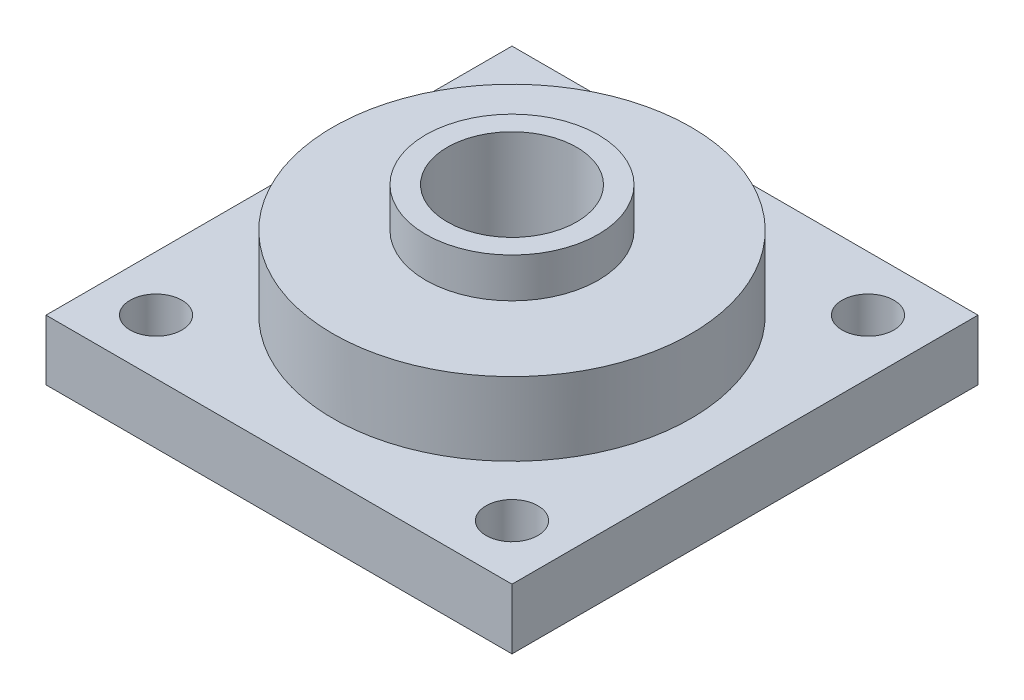
ISO-10303-21;
HEADER;
FILE_DESCRIPTION(('STEP AP214'),'2;1');
FILE_NAME('part.step','',(''),(''),'','','');
FILE_SCHEMA(('AUTOMOTIVE_DESIGN { 1 0 10303 214 1 1 1 1 }'));
ENDSEC;
DATA;
#1=APPLICATION_CONTEXT('core data for automotive mechanical design processes');
#2=APPLICATION_PROTOCOL_DEFINITION('international standard','automotive_design',2000,#1);
#3=PRODUCT_CONTEXT('',#1,'mechanical');
#4=PRODUCT('Part','Part','',(#3));
#5=PRODUCT_RELATED_PRODUCT_CATEGORY('part','',(#4));
#6=PRODUCT_DEFINITION_FORMATION('','',#4);
#7=PRODUCT_DEFINITION_CONTEXT('part definition',#1,'design');
#8=PRODUCT_DEFINITION('design','',#6,#7);
#9=PRODUCT_DEFINITION_SHAPE('','',#8);
#10=(LENGTH_UNIT() NAMED_UNIT(*) SI_UNIT(.MILLI.,.METRE.));
#11=(NAMED_UNIT(*) PLANE_ANGLE_UNIT() SI_UNIT($,.RADIAN.));
#12=(NAMED_UNIT(*) SI_UNIT($,.STERADIAN.) SOLID_ANGLE_UNIT());
#13=UNCERTAINTY_MEASURE_WITH_UNIT(LENGTH_MEASURE(1.E-05),#10,'distance_accuracy_value','');
#14=(GEOMETRIC_REPRESENTATION_CONTEXT(3) GLOBAL_UNCERTAINTY_ASSIGNED_CONTEXT((#13)) GLOBAL_UNIT_ASSIGNED_CONTEXT((#10,
#11,#12)) REPRESENTATION_CONTEXT('',''));
#15=CARTESIAN_POINT('',(0.,0.,0.));
#16=DIRECTION('',(0.,0.,1.));
#17=DIRECTION('',(1.,0.,0.));
#18=AXIS2_PLACEMENT_3D('',#15,#16,#17);
#19=CARTESIAN_POINT('',(0.,14.,0.));
#20=DIRECTION('',(0.,-1.,0.));
#21=DIRECTION('',(0.,0.,-1.));
#22=AXIS2_PLACEMENT_3D('',#19,#20,#21);
#23=PLANE('',#22);
#24=CARTESIAN_POINT('',(54.,14.,-54.));
#25=DIRECTION('',(0.,-1.,0.));
#26=DIRECTION('',(0.,0.,-1.));
#27=AXIS2_PLACEMENT_3D('',#24,#25,#26);
#28=CIRCLE('',#27,41.5);
#29=CARTESIAN_POINT('',(54.,14.,-95.5));
#30=VERTEX_POINT('',#29);
#31=EDGE_CURVE('E11',#30,#30,#28,.F.);
#32=ORIENTED_EDGE('',*,*,#31,.F.);
#33=EDGE_LOOP('',(#32));
#34=FACE_BOUND('',#33,.T.);
#35=CARTESIAN_POINT('',(12.7499999999997,14.,-95.25));
#36=DIRECTION('',(0.,1.,0.));
#37=DIRECTION('',(0.,0.,1.));
#38=AXIS2_PLACEMENT_3D('',#35,#36,#37);
#39=CIRCLE('',#38,6.);
#40=CARTESIAN_POINT('',(12.7499999999997,14.,-89.25));
#41=VERTEX_POINT('',#40);
#42=EDGE_CURVE('E147',#41,#41,#39,.T.);
#43=ORIENTED_EDGE('',*,*,#42,.F.);
#44=EDGE_LOOP('',(#43));
#45=FACE_BOUND('',#44,.T.);
#46=CARTESIAN_POINT('',(95.2499999999997,14.,-95.25));
#47=DIRECTION('',(0.,1.,0.));
#48=DIRECTION('',(0.,0.,1.));
#49=AXIS2_PLACEMENT_3D('',#46,#47,#48);
#50=CIRCLE('',#49,6.);
#51=CARTESIAN_POINT('',(95.2499999999997,14.,-89.25));
#52=VERTEX_POINT('',#51);
#53=EDGE_CURVE('E155',#52,#52,#50,.T.);
#54=ORIENTED_EDGE('',*,*,#53,.F.);
#55=EDGE_LOOP('',(#54));
#56=FACE_BOUND('',#55,.T.);
#57=CARTESIAN_POINT('',(95.25,14.,-12.75));
#58=DIRECTION('',(0.,1.,0.));
#59=DIRECTION('',(0.,0.,1.));
#60=AXIS2_PLACEMENT_3D('',#57,#58,#59);
#61=CIRCLE('',#60,6.);
#62=CARTESIAN_POINT('',(95.25,14.,-6.75));
#63=VERTEX_POINT('',#62);
#64=EDGE_CURVE('E167',#63,#63,#61,.T.);
#65=ORIENTED_EDGE('',*,*,#64,.F.);
#66=EDGE_LOOP('',(#65));
#67=FACE_BOUND('',#66,.T.);
#68=CARTESIAN_POINT('',(12.75,14.,-12.75));
#69=DIRECTION('',(0.,1.,0.));
#70=DIRECTION('',(0.,0.,1.));
#71=AXIS2_PLACEMENT_3D('',#68,#69,#70);
#72=CIRCLE('',#71,6.);
#73=CARTESIAN_POINT('',(12.75,14.,-6.75));
#74=VERTEX_POINT('',#73);
#75=EDGE_CURVE('E114',#74,#74,#72,.T.);
#76=ORIENTED_EDGE('',*,*,#75,.F.);
#77=EDGE_LOOP('',(#76));
#78=FACE_BOUND('',#77,.T.);
#79=DIRECTION('',(0.,0.,1.));
#80=VECTOR('',#79,1.);
#81=CARTESIAN_POINT('',(0.,14.,0.));
#82=LINE('',#81,#80);
#83=CARTESIAN_POINT('',(0.,14.,-108.));
#84=VERTEX_POINT('',#83);
#85=CARTESIAN_POINT('',(0.,14.,0.));
#86=VERTEX_POINT('',#85);
#87=EDGE_CURVE('E92',#84,#86,#82,.T.);
#88=ORIENTED_EDGE('',*,*,#87,.T.);
#89=DIRECTION('',(1.,0.,0.));
#90=VECTOR('',#89,1.);
#91=CARTESIAN_POINT('',(0.,14.,0.));
#92=LINE('',#91,#90);
#93=CARTESIAN_POINT('',(108.,14.,0.));
#94=VERTEX_POINT('',#93);
#95=EDGE_CURVE('E88',#86,#94,#92,.T.);
#96=ORIENTED_EDGE('',*,*,#95,.T.);
#97=DIRECTION('',(0.,0.,-1.));
#98=VECTOR('',#97,1.);
#99=CARTESIAN_POINT('',(108.,14.,0.));
#100=LINE('',#99,#98);
#101=CARTESIAN_POINT('',(108.,14.,-108.));
#102=VERTEX_POINT('',#101);
#103=EDGE_CURVE('E90',#94,#102,#100,.T.);
#104=ORIENTED_EDGE('',*,*,#103,.T.);
#105=DIRECTION('',(-1.,0.,0.));
#106=VECTOR('',#105,1.);
#107=CARTESIAN_POINT('',(0.,14.,-108.));
#108=LINE('',#107,#106);
#109=EDGE_CURVE('E57',#102,#84,#108,.T.);
#110=ORIENTED_EDGE('',*,*,#109,.T.);
#111=EDGE_LOOP('',(#88,#96,#104,#110));
#112=FACE_BOUND('',#111,.T.);
#113=ADVANCED_FACE('F39',(#34,#45,#56,#67,#78,#112),#23,.F.);
#114=CARTESIAN_POINT('',(0.,0.,0.));
#115=DIRECTION('',(0.,-1.,0.));
#116=DIRECTION('',(0.,0.,-1.));
#117=AXIS2_PLACEMENT_3D('',#114,#115,#116);
#118=PLANE('',#117);
#119=CARTESIAN_POINT('',(95.2499999999997,0.,-95.25));
#120=DIRECTION('',(0.,1.,0.));
#121=DIRECTION('',(0.,0.,1.));
#122=AXIS2_PLACEMENT_3D('',#119,#120,#121);
#123=CIRCLE('',#122,6.);
#124=CARTESIAN_POINT('',(95.2499999999997,0.,-89.25));
#125=VERTEX_POINT('',#124);
#126=EDGE_CURVE('E151',#125,#125,#123,.T.);
#127=ORIENTED_EDGE('',*,*,#126,.T.);
#128=EDGE_LOOP('',(#127));
#129=FACE_BOUND('',#128,.T.);
#130=CARTESIAN_POINT('',(95.25,0.,-12.75));
#131=DIRECTION('',(0.,1.,0.));
#132=DIRECTION('',(0.,0.,1.));
#133=AXIS2_PLACEMENT_3D('',#130,#131,#132);
#134=CIRCLE('',#133,6.);
#135=CARTESIAN_POINT('',(95.25,0.,-6.75));
#136=VERTEX_POINT('',#135);
#137=EDGE_CURVE('E166',#136,#136,#134,.T.);
#138=ORIENTED_EDGE('',*,*,#137,.T.);
#139=EDGE_LOOP('',(#138));
#140=FACE_BOUND('',#139,.T.);
#141=DIRECTION('',(0.,0.,1.));
#142=VECTOR('',#141,1.);
#143=CARTESIAN_POINT('',(0.,0.,0.));
#144=LINE('',#143,#142);
#145=CARTESIAN_POINT('',(0.,0.,-108.));
#146=VERTEX_POINT('',#145);
#147=CARTESIAN_POINT('',(0.,0.,0.));
#148=VERTEX_POINT('',#147);
#149=EDGE_CURVE('E110',#146,#148,#144,.T.);
#150=ORIENTED_EDGE('',*,*,#149,.F.);
#151=DIRECTION('',(-1.,0.,0.));
#152=VECTOR('',#151,1.);
#153=CARTESIAN_POINT('',(0.,0.,-108.));
#154=LINE('',#153,#152);
#155=CARTESIAN_POINT('',(108.,0.,-108.));
#156=VERTEX_POINT('',#155);
#157=EDGE_CURVE('E80',#156,#146,#154,.T.);
#158=ORIENTED_EDGE('',*,*,#157,.F.);
#159=DIRECTION('',(0.,0.,-1.));
#160=VECTOR('',#159,1.);
#161=CARTESIAN_POINT('',(108.,0.,0.));
#162=LINE('',#161,#160);
#163=CARTESIAN_POINT('',(108.,0.,0.));
#164=VERTEX_POINT('',#163);
#165=EDGE_CURVE('E74',#164,#156,#162,.T.);
#166=ORIENTED_EDGE('',*,*,#165,.F.);
#167=DIRECTION('',(1.,0.,0.));
#168=VECTOR('',#167,1.);
#169=CARTESIAN_POINT('',(0.,0.,0.));
#170=LINE('',#169,#168);
#171=EDGE_CURVE('E98',#148,#164,#170,.T.);
#172=ORIENTED_EDGE('',*,*,#171,.F.);
#173=EDGE_LOOP('',(#150,#158,#166,#172));
#174=FACE_BOUND('',#173,.T.);
#175=CARTESIAN_POINT('',(12.75,0.,-12.75));
#176=DIRECTION('',(0.,1.,0.));
#177=DIRECTION('',(0.,0.,1.));
#178=AXIS2_PLACEMENT_3D('',#175,#176,#177);
#179=CIRCLE('',#178,6.);
#180=CARTESIAN_POINT('',(12.75,0.,-6.75));
#181=VERTEX_POINT('',#180);
#182=EDGE_CURVE('E171',#181,#181,#179,.T.);
#183=ORIENTED_EDGE('',*,*,#182,.T.);
#184=EDGE_LOOP('',(#183));
#185=FACE_BOUND('',#184,.T.);
#186=CARTESIAN_POINT('',(54.,0.,-54.));
#187=DIRECTION('',(0.,1.,0.));
#188=DIRECTION('',(0.,0.,1.));
#189=AXIS2_PLACEMENT_3D('',#186,#187,#188);
#190=CIRCLE('',#189,15.);
#191=CARTESIAN_POINT('',(54.,0.,-39.));
#192=VERTEX_POINT('',#191);
#193=EDGE_CURVE('E159',#192,#192,#190,.T.);
#194=ORIENTED_EDGE('',*,*,#193,.T.);
#195=EDGE_LOOP('',(#194));
#196=FACE_BOUND('',#195,.T.);
#197=CARTESIAN_POINT('',(12.7499999999997,0.,-95.25));
#198=DIRECTION('',(0.,1.,0.));
#199=DIRECTION('',(0.,0.,1.));
#200=AXIS2_PLACEMENT_3D('',#197,#198,#199);
#201=CIRCLE('',#200,6.);
#202=CARTESIAN_POINT('',(12.7499999999997,0.,-89.25));
#203=VERTEX_POINT('',#202);
#204=EDGE_CURVE('E146',#203,#203,#201,.T.);
#205=ORIENTED_EDGE('',*,*,#204,.T.);
#206=EDGE_LOOP('',(#205));
#207=FACE_BOUND('',#206,.T.);
#208=ADVANCED_FACE('F183',(#129,#140,#174,#185,#196,#207),#118,.T.);
#209=CARTESIAN_POINT('',(0.,14.,0.));
#210=DIRECTION('',(1.,0.,0.));
#211=DIRECTION('',(0.,0.,-1.));
#212=AXIS2_PLACEMENT_3D('',#209,#210,#211);
#213=PLANE('',#212);
#214=ORIENTED_EDGE('',*,*,#149,.T.);
#215=DIRECTION('',(0.,-1.,0.));
#216=VECTOR('',#215,1.);
#217=CARTESIAN_POINT('',(0.,14.,0.));
#218=LINE('',#217,#216);
#219=EDGE_CURVE('E49',#86,#148,#218,.T.);
#220=ORIENTED_EDGE('',*,*,#219,.F.);
#221=ORIENTED_EDGE('',*,*,#87,.F.);
#222=DIRECTION('',(0.,-1.,0.));
#223=VECTOR('',#222,1.);
#224=CARTESIAN_POINT('',(0.,14.,-108.));
#225=LINE('',#224,#223);
#226=EDGE_CURVE('E106',#84,#146,#225,.T.);
#227=ORIENTED_EDGE('',*,*,#226,.T.);
#228=EDGE_LOOP('',(#214,#220,#221,#227));
#229=FACE_BOUND('',#228,.T.);
#230=ADVANCED_FACE('F41',(#229),#213,.F.);
#231=CARTESIAN_POINT('',(0.,14.,0.));
#232=DIRECTION('',(0.,0.,-1.));
#233=DIRECTION('',(-1.,0.,0.));
#234=AXIS2_PLACEMENT_3D('',#231,#232,#233);
#235=PLANE('',#234);
#236=ORIENTED_EDGE('',*,*,#171,.T.);
#237=DIRECTION('',(0.,-1.,0.));
#238=VECTOR('',#237,1.);
#239=CARTESIAN_POINT('',(108.,14.,0.));
#240=LINE('',#239,#238);
#241=EDGE_CURVE('E96',#94,#164,#240,.T.);
#242=ORIENTED_EDGE('',*,*,#241,.F.);
#243=ORIENTED_EDGE('',*,*,#95,.F.);
#244=ORIENTED_EDGE('',*,*,#219,.T.);
#245=EDGE_LOOP('',(#236,#242,#243,#244));
#246=FACE_BOUND('',#245,.T.);
#247=ADVANCED_FACE('F97',(#246),#235,.F.);
#248=CARTESIAN_POINT('',(108.,14.,0.));
#249=DIRECTION('',(-1.,0.,0.));
#250=DIRECTION('',(0.,0.,1.));
#251=AXIS2_PLACEMENT_3D('',#248,#249,#250);
#252=PLANE('',#251);
#253=ORIENTED_EDGE('',*,*,#165,.T.);
#254=DIRECTION('',(0.,-1.,0.));
#255=VECTOR('',#254,1.);
#256=CARTESIAN_POINT('',(108.,14.,-108.));
#257=LINE('',#256,#255);
#258=EDGE_CURVE('E100',#102,#156,#257,.T.);
#259=ORIENTED_EDGE('',*,*,#258,.F.);
#260=ORIENTED_EDGE('',*,*,#103,.F.);
#261=ORIENTED_EDGE('',*,*,#241,.T.);
#262=EDGE_LOOP('',(#253,#259,#260,#261));
#263=FACE_BOUND('',#262,.T.);
#264=ADVANCED_FACE('F102',(#263),#252,.F.);
#265=CARTESIAN_POINT('',(0.,14.,-108.));
#266=DIRECTION('',(0.,0.,1.));
#267=DIRECTION('',(1.,0.,0.));
#268=AXIS2_PLACEMENT_3D('',#265,#266,#267);
#269=PLANE('',#268);
#270=ORIENTED_EDGE('',*,*,#157,.T.);
#271=ORIENTED_EDGE('',*,*,#226,.F.);
#272=ORIENTED_EDGE('',*,*,#109,.F.);
#273=ORIENTED_EDGE('',*,*,#258,.T.);
#274=EDGE_LOOP('',(#270,#271,#272,#273));
#275=FACE_BOUND('',#274,.T.);
#276=ADVANCED_FACE('F189',(#275),#269,.F.);
#277=CARTESIAN_POINT('',(12.75,14.,-12.75));
#278=DIRECTION('',(0.,-1.,0.));
#279=DIRECTION('',(0.,0.,-1.));
#280=AXIS2_PLACEMENT_3D('',#277,#278,#279);
#281=CYLINDRICAL_SURFACE('',#280,6.);
#282=ORIENTED_EDGE('',*,*,#75,.T.);
#283=EDGE_LOOP('',(#282));
#284=FACE_BOUND('',#283,.T.);
#285=ORIENTED_EDGE('',*,*,#182,.F.);
#286=EDGE_LOOP('',(#285));
#287=FACE_BOUND('',#286,.T.);
#288=ADVANCED_FACE('F186',(#284,#287),#281,.F.);
#289=CARTESIAN_POINT('',(95.25,14.,-12.75));
#290=DIRECTION('',(0.,-1.,0.));
#291=DIRECTION('',(0.,0.,-1.));
#292=AXIS2_PLACEMENT_3D('',#289,#290,#291);
#293=CYLINDRICAL_SURFACE('',#292,6.);
#294=ORIENTED_EDGE('',*,*,#64,.T.);
#295=EDGE_LOOP('',(#294));
#296=FACE_BOUND('',#295,.T.);
#297=ORIENTED_EDGE('',*,*,#137,.F.);
#298=EDGE_LOOP('',(#297));
#299=FACE_BOUND('',#298,.T.);
#300=ADVANCED_FACE('F188',(#296,#299),#293,.F.);
#301=CARTESIAN_POINT('',(54.,14.,-54.));
#302=DIRECTION('',(0.,-1.,0.));
#303=DIRECTION('',(0.,0.,-1.));
#304=AXIS2_PLACEMENT_3D('',#301,#302,#303);
#305=CYLINDRICAL_SURFACE('',#304,15.);
#306=CARTESIAN_POINT('',(54.,40.2,-54.));
#307=DIRECTION('',(0.,1.,0.));
#308=DIRECTION('',(0.,0.,1.));
#309=AXIS2_PLACEMENT_3D('',#306,#307,#308);
#310=CIRCLE('',#309,15.);
#311=CARTESIAN_POINT('',(54.,40.2,-39.));
#312=VERTEX_POINT('',#311);
#313=EDGE_CURVE('E129',#312,#312,#310,.T.);
#314=ORIENTED_EDGE('',*,*,#313,.T.);
#315=EDGE_LOOP('',(#314));
#316=FACE_BOUND('',#315,.T.);
#317=ORIENTED_EDGE('',*,*,#193,.F.);
#318=EDGE_LOOP('',(#317));
#319=FACE_BOUND('',#318,.T.);
#320=ADVANCED_FACE('F196',(#316,#319),#305,.F.);
#321=CARTESIAN_POINT('',(95.2499999999997,14.,-95.25));
#322=DIRECTION('',(0.,-1.,0.));
#323=DIRECTION('',(0.,0.,-1.));
#324=AXIS2_PLACEMENT_3D('',#321,#322,#323);
#325=CYLINDRICAL_SURFACE('',#324,6.);
#326=ORIENTED_EDGE('',*,*,#53,.T.);
#327=EDGE_LOOP('',(#326));
#328=FACE_BOUND('',#327,.T.);
#329=ORIENTED_EDGE('',*,*,#126,.F.);
#330=EDGE_LOOP('',(#329));
#331=FACE_BOUND('',#330,.T.);
#332=ADVANCED_FACE('F261',(#328,#331),#325,.F.);
#333=CARTESIAN_POINT('',(12.7499999999997,14.,-95.25));
#334=DIRECTION('',(0.,-1.,0.));
#335=DIRECTION('',(0.,0.,-1.));
#336=AXIS2_PLACEMENT_3D('',#333,#334,#335);
#337=CYLINDRICAL_SURFACE('',#336,6.);
#338=ORIENTED_EDGE('',*,*,#42,.T.);
#339=EDGE_LOOP('',(#338));
#340=FACE_BOUND('',#339,.T.);
#341=ORIENTED_EDGE('',*,*,#204,.F.);
#342=EDGE_LOOP('',(#341));
#343=FACE_BOUND('',#342,.T.);
#344=ADVANCED_FACE('F273',(#340,#343),#337,.F.);
#345=CARTESIAN_POINT('',(54.,40.2,-54.));
#346=DIRECTION('',(0.,1.,0.));
#347=DIRECTION('',(0.,0.,1.));
#348=AXIS2_PLACEMENT_3D('',#345,#346,#347);
#349=PLANE('',#348);
#350=CARTESIAN_POINT('',(54.,40.2,-54.));
#351=DIRECTION('',(0.,1.,0.));
#352=DIRECTION('',(0.,0.,1.));
#353=AXIS2_PLACEMENT_3D('',#350,#351,#352);
#354=CIRCLE('',#353,20.);
#355=CARTESIAN_POINT('',(54.,40.2,-34.));
#356=VERTEX_POINT('',#355);
#357=EDGE_CURVE('E136',#356,#356,#354,.T.);
#358=ORIENTED_EDGE('',*,*,#357,.T.);
#359=EDGE_LOOP('',(#358));
#360=FACE_BOUND('',#359,.T.);
#361=ORIENTED_EDGE('',*,*,#313,.F.);
#362=EDGE_LOOP('',(#361));
#363=FACE_BOUND('',#362,.T.);
#364=ADVANCED_FACE('F281',(#360,#363),#349,.T.);
#365=CARTESIAN_POINT('',(54.,40.2,-54.));
#366=DIRECTION('',(0.,-1.,0.));
#367=DIRECTION('',(0.,0.,-1.));
#368=AXIS2_PLACEMENT_3D('',#365,#366,#367);
#369=CYLINDRICAL_SURFACE('',#368,20.);
#370=CARTESIAN_POINT('',(54.,31.,-54.));
#371=DIRECTION('',(0.,1.,0.));
#372=DIRECTION('',(0.,0.,1.));
#373=AXIS2_PLACEMENT_3D('',#370,#371,#372);
#374=CIRCLE('',#373,20.);
#375=CARTESIAN_POINT('',(54.,31.,-34.));
#376=VERTEX_POINT('',#375);
#377=EDGE_CURVE('E126',#376,#376,#374,.T.);
#378=ORIENTED_EDGE('',*,*,#377,.T.);
#379=EDGE_LOOP('',(#378));
#380=FACE_BOUND('',#379,.T.);
#381=ORIENTED_EDGE('',*,*,#357,.F.);
#382=EDGE_LOOP('',(#381));
#383=FACE_BOUND('',#382,.T.);
#384=ADVANCED_FACE('F294',(#380,#383),#369,.T.);
#385=CARTESIAN_POINT('',(54.,31.,-54.));
#386=DIRECTION('',(0.,1.,0.));
#387=DIRECTION('',(0.,0.,1.));
#388=AXIS2_PLACEMENT_3D('',#385,#386,#387);
#389=PLANE('',#388);
#390=ORIENTED_EDGE('',*,*,#377,.F.);
#391=EDGE_LOOP('',(#390));
#392=FACE_BOUND('',#391,.T.);
#393=CARTESIAN_POINT('',(54.,31.,-54.));
#394=DIRECTION('',(0.,1.,0.));
#395=DIRECTION('',(0.,0.,1.));
#396=AXIS2_PLACEMENT_3D('',#393,#394,#395);
#397=CIRCLE('',#396,41.5);
#398=CARTESIAN_POINT('',(54.,31.,-12.5));
#399=VERTEX_POINT('',#398);
#400=EDGE_CURVE('E130',#399,#399,#397,.T.);
#401=ORIENTED_EDGE('',*,*,#400,.T.);
#402=EDGE_LOOP('',(#401));
#403=FACE_BOUND('',#402,.T.);
#404=ADVANCED_FACE('F299',(#392,#403),#389,.T.);
#405=CARTESIAN_POINT('',(54.,31.,-54.));
#406=DIRECTION('',(0.,-1.,0.));
#407=DIRECTION('',(0.,0.,-1.));
#408=AXIS2_PLACEMENT_3D('',#405,#406,#407);
#409=CYLINDRICAL_SURFACE('',#408,41.5);
#410=ORIENTED_EDGE('',*,*,#400,.F.);
#411=EDGE_LOOP('',(#410));
#412=FACE_BOUND('',#411,.T.);
#413=ORIENTED_EDGE('',*,*,#31,.T.);
#414=EDGE_LOOP('',(#413));
#415=FACE_BOUND('',#414,.T.);
#416=ADVANCED_FACE('F308',(#412,#415),#409,.T.);
#417=CLOSED_SHELL('',(#113,#208,#230,#247,#264,#276,#288,#300,#320,#332,#344,#364,#384,#404,#416));
#418=MANIFOLD_SOLID_BREP('B2',#417);
#419=ADVANCED_BREP_SHAPE_REPRESENTATION('',(#18,#418),#14);
#420=SHAPE_DEFINITION_REPRESENTATION(#9,#419);
ENDSEC;
END-ISO-10303-21;
